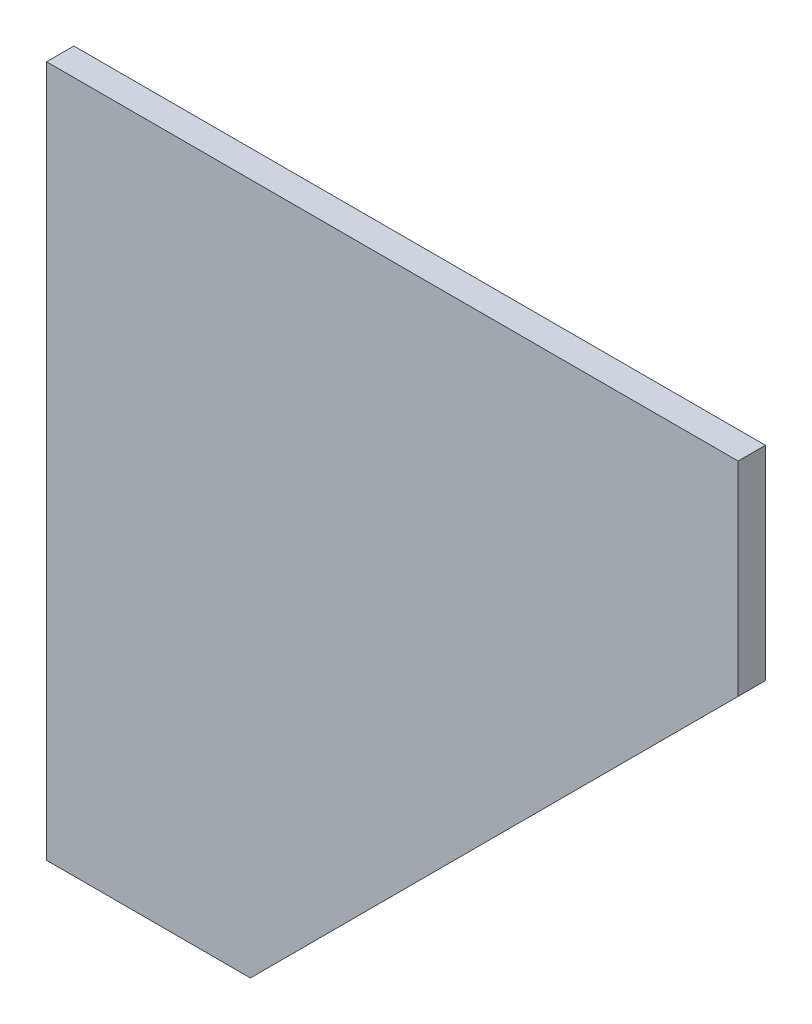
ISO-10303-21;
HEADER;
FILE_DESCRIPTION(('STEP AP214'),'2;1');
FILE_NAME('part.step','',(''),(''),'','','');
FILE_SCHEMA(('AUTOMOTIVE_DESIGN { 1 0 10303 214 1 1 1 1 }'));
ENDSEC;
DATA;
#1=APPLICATION_CONTEXT('core data for automotive mechanical design processes');
#2=APPLICATION_PROTOCOL_DEFINITION('international standard','automotive_design',2000,#1);
#3=PRODUCT_CONTEXT('',#1,'mechanical');
#4=PRODUCT('Part','Part','',(#3));
#5=PRODUCT_RELATED_PRODUCT_CATEGORY('part','',(#4));
#6=PRODUCT_DEFINITION_FORMATION('','',#4);
#7=PRODUCT_DEFINITION_CONTEXT('part definition',#1,'design');
#8=PRODUCT_DEFINITION('design','',#6,#7);
#9=PRODUCT_DEFINITION_SHAPE('','',#8);
#10=(LENGTH_UNIT() NAMED_UNIT(*) SI_UNIT(.MILLI.,.METRE.));
#11=(NAMED_UNIT(*) PLANE_ANGLE_UNIT() SI_UNIT($,.RADIAN.));
#12=(NAMED_UNIT(*) SI_UNIT($,.STERADIAN.) SOLID_ANGLE_UNIT());
#13=UNCERTAINTY_MEASURE_WITH_UNIT(LENGTH_MEASURE(1.E-05),#10,'distance_accuracy_value','');
#14=(GEOMETRIC_REPRESENTATION_CONTEXT(3) GLOBAL_UNCERTAINTY_ASSIGNED_CONTEXT((#13)) GLOBAL_UNIT_ASSIGNED_CONTEXT((#10,
#11,#12)) REPRESENTATION_CONTEXT('',''));
#15=CARTESIAN_POINT('',(0.,0.,0.));
#16=DIRECTION('',(0.,0.,1.));
#17=DIRECTION('',(1.,0.,0.));
#18=AXIS2_PLACEMENT_3D('',#15,#16,#17);
#19=CARTESIAN_POINT('',(150.8125,-150.8125,11.90625));
#20=DIRECTION('',(-1.,0.,0.));
#21=DIRECTION('',(0.,0.,1.));
#22=AXIS2_PLACEMENT_3D('',#19,#20,#21);
#23=PLANE('',#22);
#24=DIRECTION('',(0.,1.,0.));
#25=VECTOR('',#24,1.);
#26=CARTESIAN_POINT('',(150.8125,-150.8125,11.90625));
#27=LINE('',#26,#25);
#28=CARTESIAN_POINT('',(150.8125,61.9125000000007,11.90625));
#29=VERTEX_POINT('',#28);
#30=CARTESIAN_POINT('',(150.8125,150.8125,11.90625));
#31=VERTEX_POINT('',#30);
#32=EDGE_CURVE('E85',#29,#31,#27,.T.);
#33=ORIENTED_EDGE('',*,*,#32,.F.);
#34=DIRECTION('',(0.,0.,-1.));
#35=VECTOR('',#34,1.);
#36=CARTESIAN_POINT('',(150.8125,61.9125000000007,11.90625));
#37=LINE('',#36,#35);
#38=CARTESIAN_POINT('',(150.8125,61.9125000000007,0.));
#39=VERTEX_POINT('',#38);
#40=EDGE_CURVE('E108',#29,#39,#37,.T.);
#41=ORIENTED_EDGE('',*,*,#40,.T.);
#42=DIRECTION('',(0.,1.,0.));
#43=VECTOR('',#42,1.);
#44=CARTESIAN_POINT('',(150.8125,-150.8125,0.));
#45=LINE('',#44,#43);
#46=CARTESIAN_POINT('',(150.8125,150.8125,0.));
#47=VERTEX_POINT('',#46);
#48=EDGE_CURVE('E106',#39,#47,#45,.T.);
#49=ORIENTED_EDGE('',*,*,#48,.T.);
#50=DIRECTION('',(0.,0.,-1.));
#51=VECTOR('',#50,1.);
#52=CARTESIAN_POINT('',(150.8125,150.8125,11.90625));
#53=LINE('',#52,#51);
#54=EDGE_CURVE('E100',#31,#47,#53,.T.);
#55=ORIENTED_EDGE('',*,*,#54,.F.);
#56=EDGE_LOOP('',(#33,#41,#49,#55));
#57=FACE_BOUND('',#56,.T.);
#58=ADVANCED_FACE('F38',(#57),#23,.F.);
#59=CARTESIAN_POINT('',(-150.8125,150.8125,11.90625));
#60=DIRECTION('',(0.,-1.,0.));
#61=DIRECTION('',(0.,0.,-1.));
#62=AXIS2_PLACEMENT_3D('',#59,#60,#61);
#63=PLANE('',#62);
#64=DIRECTION('',(-1.,0.,0.));
#65=VECTOR('',#64,1.);
#66=CARTESIAN_POINT('',(-150.8125,150.8125,0.));
#67=LINE('',#66,#65);
#68=CARTESIAN_POINT('',(-150.8125,150.8125,0.));
#69=VERTEX_POINT('',#68);
#70=EDGE_CURVE('E121',#47,#69,#67,.T.);
#71=ORIENTED_EDGE('',*,*,#70,.T.);
#72=DIRECTION('',(0.,0.,-1.));
#73=VECTOR('',#72,1.);
#74=CARTESIAN_POINT('',(-150.8125,150.8125,11.90625));
#75=LINE('',#74,#73);
#76=CARTESIAN_POINT('',(-150.8125,150.8125,11.90625));
#77=VERTEX_POINT('',#76);
#78=EDGE_CURVE('E102',#77,#69,#75,.T.);
#79=ORIENTED_EDGE('',*,*,#78,.F.);
#80=DIRECTION('',(-1.,0.,0.));
#81=VECTOR('',#80,1.);
#82=CARTESIAN_POINT('',(-150.8125,150.8125,11.90625));
#83=LINE('',#82,#81);
#84=EDGE_CURVE('E88',#31,#77,#83,.T.);
#85=ORIENTED_EDGE('',*,*,#84,.F.);
#86=ORIENTED_EDGE('',*,*,#54,.T.);
#87=EDGE_LOOP('',(#71,#79,#85,#86));
#88=FACE_BOUND('',#87,.T.);
#89=ADVANCED_FACE('F99',(#88),#63,.F.);
#90=CARTESIAN_POINT('',(-150.8125,-150.8125,11.90625));
#91=DIRECTION('',(1.,0.,0.));
#92=DIRECTION('',(0.,0.,-1.));
#93=AXIS2_PLACEMENT_3D('',#90,#91,#92);
#94=PLANE('',#93);
#95=DIRECTION('',(0.,-1.,0.));
#96=VECTOR('',#95,1.);
#97=CARTESIAN_POINT('',(-150.8125,-150.8125,0.));
#98=LINE('',#97,#96);
#99=CARTESIAN_POINT('',(-150.8125,-150.8125,0.));
#100=VERTEX_POINT('',#99);
#101=EDGE_CURVE('E119',#69,#100,#98,.T.);
#102=ORIENTED_EDGE('',*,*,#101,.T.);
#103=DIRECTION('',(0.,0.,-1.));
#104=VECTOR('',#103,1.);
#105=CARTESIAN_POINT('',(-150.8125,-150.8125,11.90625));
#106=LINE('',#105,#104);
#107=CARTESIAN_POINT('',(-150.8125,-150.8125,11.90625));
#108=VERTEX_POINT('',#107);
#109=EDGE_CURVE('E111',#108,#100,#106,.T.);
#110=ORIENTED_EDGE('',*,*,#109,.F.);
#111=DIRECTION('',(0.,-1.,0.));
#112=VECTOR('',#111,1.);
#113=CARTESIAN_POINT('',(-150.8125,-150.8125,11.90625));
#114=LINE('',#113,#112);
#115=EDGE_CURVE('E104',#77,#108,#114,.T.);
#116=ORIENTED_EDGE('',*,*,#115,.F.);
#117=ORIENTED_EDGE('',*,*,#78,.T.);
#118=EDGE_LOOP('',(#102,#110,#116,#117));
#119=FACE_BOUND('',#118,.T.);
#120=ADVANCED_FACE('F127',(#119),#94,.F.);
#121=CARTESIAN_POINT('',(-150.8125,-150.8125,11.90625));
#122=DIRECTION('',(0.,1.,0.));
#123=DIRECTION('',(0.,0.,1.));
#124=AXIS2_PLACEMENT_3D('',#121,#122,#123);
#125=PLANE('',#124);
#126=DIRECTION('',(1.,0.,0.));
#127=VECTOR('',#126,1.);
#128=CARTESIAN_POINT('',(-150.8125,-150.8125,0.));
#129=LINE('',#128,#127);
#130=CARTESIAN_POINT('',(-61.9125000000008,-150.8125,0.));
#131=VERTEX_POINT('',#130);
#132=EDGE_CURVE('E95',#100,#131,#129,.T.);
#133=ORIENTED_EDGE('',*,*,#132,.T.);
#134=DIRECTION('',(0.,0.,1.));
#135=VECTOR('',#134,1.);
#136=CARTESIAN_POINT('',(-61.9125000000008,-150.8125,11.90625));
#137=LINE('',#136,#135);
#138=CARTESIAN_POINT('',(-61.9125000000008,-150.8125,11.90625));
#139=VERTEX_POINT('',#138);
#140=EDGE_CURVE('E47',#131,#139,#137,.T.);
#141=ORIENTED_EDGE('',*,*,#140,.T.);
#142=DIRECTION('',(1.,0.,0.));
#143=VECTOR('',#142,1.);
#144=CARTESIAN_POINT('',(-150.8125,-150.8125,11.90625));
#145=LINE('',#144,#143);
#146=EDGE_CURVE('E117',#108,#139,#145,.T.);
#147=ORIENTED_EDGE('',*,*,#146,.F.);
#148=ORIENTED_EDGE('',*,*,#109,.T.);
#149=EDGE_LOOP('',(#133,#141,#147,#148));
#150=FACE_BOUND('',#149,.T.);
#151=ADVANCED_FACE('F129',(#150),#125,.F.);
#152=CARTESIAN_POINT('',(0.,0.,11.90625));
#153=DIRECTION('',(0.,0.,-1.));
#154=DIRECTION('',(-1.,0.,0.));
#155=AXIS2_PLACEMENT_3D('',#152,#153,#154);
#156=PLANE('',#155);
#157=ORIENTED_EDGE('',*,*,#146,.T.);
#158=DIRECTION('',(-0.707106781186548,-0.707106781186548,0.));
#159=VECTOR('',#158,1.);
#160=CARTESIAN_POINT('',(150.8125,61.9125000000007,11.90625));
#161=LINE('',#160,#159);
#162=EDGE_CURVE('E11',#139,#29,#161,.F.);
#163=ORIENTED_EDGE('',*,*,#162,.T.);
#164=ORIENTED_EDGE('',*,*,#32,.T.);
#165=ORIENTED_EDGE('',*,*,#84,.T.);
#166=ORIENTED_EDGE('',*,*,#115,.T.);
#167=EDGE_LOOP('',(#157,#163,#164,#165,#166));
#168=FACE_BOUND('',#167,.T.);
#169=ADVANCED_FACE('F87',(#168),#156,.F.);
#170=CARTESIAN_POINT('',(0.,0.,0.));
#171=DIRECTION('',(0.,0.,-1.));
#172=DIRECTION('',(-1.,0.,0.));
#173=AXIS2_PLACEMENT_3D('',#170,#171,#172);
#174=PLANE('',#173);
#175=ORIENTED_EDGE('',*,*,#48,.F.);
#176=DIRECTION('',(0.707106781186548,0.707106781186548,0.));
#177=VECTOR('',#176,1.);
#178=CARTESIAN_POINT('',(44.4499999999996,-44.4499999999996,0.));
#179=LINE('',#178,#177);
#180=EDGE_CURVE('E61',#39,#131,#179,.F.);
#181=ORIENTED_EDGE('',*,*,#180,.T.);
#182=ORIENTED_EDGE('',*,*,#132,.F.);
#183=ORIENTED_EDGE('',*,*,#101,.F.);
#184=ORIENTED_EDGE('',*,*,#70,.F.);
#185=EDGE_LOOP('',(#175,#181,#182,#183,#184));
#186=FACE_BOUND('',#185,.T.);
#187=ADVANCED_FACE('F136',(#186),#174,.T.);
#188=CARTESIAN_POINT('',(150.8125,61.9125000000007,11.90625));
#189=DIRECTION('',(-0.707106781186548,0.707106781186548,0.));
#190=DIRECTION('',(0.,0.,-1.));
#191=AXIS2_PLACEMENT_3D('',#188,#189,#190);
#192=PLANE('',#191);
#193=ORIENTED_EDGE('',*,*,#162,.F.);
#194=ORIENTED_EDGE('',*,*,#140,.F.);
#195=ORIENTED_EDGE('',*,*,#180,.F.);
#196=ORIENTED_EDGE('',*,*,#40,.F.);
#197=EDGE_LOOP('',(#193,#194,#195,#196));
#198=FACE_BOUND('',#197,.T.);
#199=ADVANCED_FACE('F41',(#198),#192,.F.);
#200=CLOSED_SHELL('',(#58,#89,#120,#151,#169,#187,#199));
#201=MANIFOLD_SOLID_BREP('B2',#200);
#202=ADVANCED_BREP_SHAPE_REPRESENTATION('',(#18,#201),#14);
#203=SHAPE_DEFINITION_REPRESENTATION(#9,#202);
ENDSEC;
END-ISO-10303-21;
